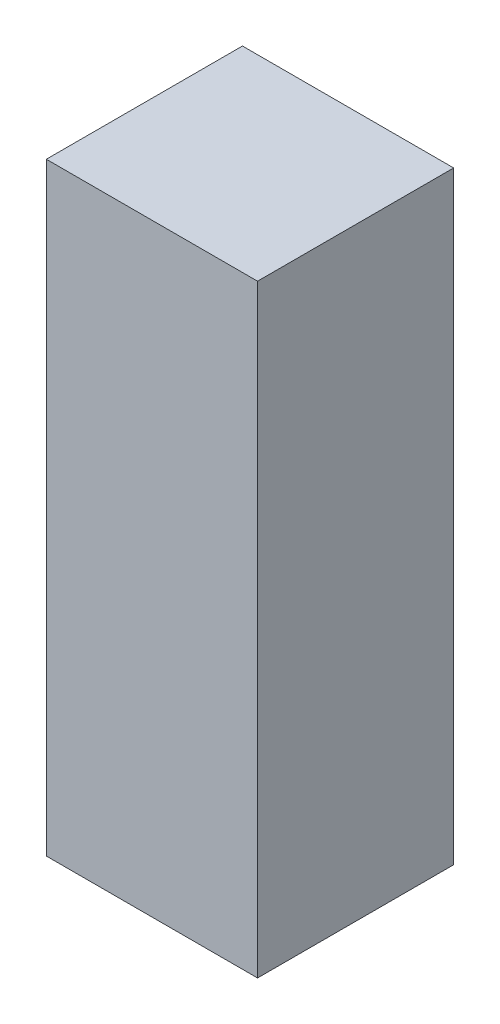
ISO-10303-21;
HEADER;
FILE_DESCRIPTION(('STEP AP214'),'2;1');
FILE_NAME('part.step','',(''),(''),'','','');
FILE_SCHEMA(('AUTOMOTIVE_DESIGN { 1 0 10303 214 1 1 1 1 }'));
ENDSEC;
DATA;
#1=APPLICATION_CONTEXT('core data for automotive mechanical design processes');
#2=APPLICATION_PROTOCOL_DEFINITION('international standard','automotive_design',2000,#1);
#3=PRODUCT_CONTEXT('',#1,'mechanical');
#4=PRODUCT('Part','Part','',(#3));
#5=PRODUCT_RELATED_PRODUCT_CATEGORY('part','',(#4));
#6=PRODUCT_DEFINITION_FORMATION('','',#4);
#7=PRODUCT_DEFINITION_CONTEXT('part definition',#1,'design');
#8=PRODUCT_DEFINITION('design','',#6,#7);
#9=PRODUCT_DEFINITION_SHAPE('','',#8);
#10=(LENGTH_UNIT() NAMED_UNIT(*) SI_UNIT(.MILLI.,.METRE.));
#11=(NAMED_UNIT(*) PLANE_ANGLE_UNIT() SI_UNIT($,.RADIAN.));
#12=(NAMED_UNIT(*) SI_UNIT($,.STERADIAN.) SOLID_ANGLE_UNIT());
#13=UNCERTAINTY_MEASURE_WITH_UNIT(LENGTH_MEASURE(1.E-05),#10,'distance_accuracy_value','');
#14=(GEOMETRIC_REPRESENTATION_CONTEXT(3) GLOBAL_UNCERTAINTY_ASSIGNED_CONTEXT((#13)) GLOBAL_UNIT_ASSIGNED_CONTEXT((#10,
#11,#12)) REPRESENTATION_CONTEXT('',''));
#15=CARTESIAN_POINT('',(0.,0.,0.));
#16=DIRECTION('',(0.,0.,1.));
#17=DIRECTION('',(1.,0.,0.));
#18=AXIS2_PLACEMENT_3D('',#15,#16,#17);
#19=CARTESIAN_POINT('',(24.,1870.,33.));
#20=DIRECTION('',(1.,0.,0.));
#21=DIRECTION('',(0.,0.,-1.));
#22=AXIS2_PLACEMENT_3D('',#19,#20,#21);
#23=PLANE('',#22);
#24=DIRECTION('',(0.,-1.,0.));
#25=VECTOR('',#24,1.);
#26=CARTESIAN_POINT('',(24.,1870.,20.));
#27=LINE('',#26,#25);
#28=CARTESIAN_POINT('',(24.,1910.,20.));
#29=VERTEX_POINT('',#28);
#30=CARTESIAN_POINT('',(24.,1870.,20.));
#31=VERTEX_POINT('',#30);
#32=EDGE_CURVE('E102',#29,#31,#27,.T.);
#33=ORIENTED_EDGE('',*,*,#32,.T.);
#34=DIRECTION('',(0.,0.,-1.));
#35=VECTOR('',#34,1.);
#36=CARTESIAN_POINT('',(24.,1870.,33.));
#37=LINE('',#36,#35);
#38=CARTESIAN_POINT('',(24.,1870.,33.));
#39=VERTEX_POINT('',#38);
#40=EDGE_CURVE('E11',#39,#31,#37,.T.);
#41=ORIENTED_EDGE('',*,*,#40,.F.);
#42=DIRECTION('',(0.,-1.,0.));
#43=VECTOR('',#42,1.);
#44=CARTESIAN_POINT('',(24.,1870.,33.));
#45=LINE('',#44,#43);
#46=CARTESIAN_POINT('',(24.,1910.,33.));
#47=VERTEX_POINT('',#46);
#48=EDGE_CURVE('E90',#47,#39,#45,.T.);
#49=ORIENTED_EDGE('',*,*,#48,.F.);
#50=DIRECTION('',(0.,0.,-1.));
#51=VECTOR('',#50,1.);
#52=CARTESIAN_POINT('',(24.,1910.,33.));
#53=LINE('',#52,#51);
#54=EDGE_CURVE('E98',#47,#29,#53,.T.);
#55=ORIENTED_EDGE('',*,*,#54,.T.);
#56=EDGE_LOOP('',(#33,#41,#49,#55));
#57=FACE_BOUND('',#56,.T.);
#58=ADVANCED_FACE('F39',(#57),#23,.F.);
#59=CARTESIAN_POINT('',(24.,1870.,33.));
#60=DIRECTION('',(0.,1.,0.));
#61=DIRECTION('',(0.,0.,1.));
#62=AXIS2_PLACEMENT_3D('',#59,#60,#61);
#63=PLANE('',#62);
#64=DIRECTION('',(1.,0.,0.));
#65=VECTOR('',#64,1.);
#66=CARTESIAN_POINT('',(24.,1870.,20.));
#67=LINE('',#66,#65);
#68=CARTESIAN_POINT('',(38.,1870.,20.));
#69=VERTEX_POINT('',#68);
#70=EDGE_CURVE('E94',#31,#69,#67,.T.);
#71=ORIENTED_EDGE('',*,*,#70,.T.);
#72=DIRECTION('',(0.,0.,-1.));
#73=VECTOR('',#72,1.);
#74=CARTESIAN_POINT('',(38.,1870.,33.));
#75=LINE('',#74,#73);
#76=CARTESIAN_POINT('',(38.,1870.,33.));
#77=VERTEX_POINT('',#76);
#78=EDGE_CURVE('E47',#77,#69,#75,.T.);
#79=ORIENTED_EDGE('',*,*,#78,.F.);
#80=DIRECTION('',(1.,0.,0.));
#81=VECTOR('',#80,1.);
#82=CARTESIAN_POINT('',(24.,1870.,33.));
#83=LINE('',#82,#81);
#84=EDGE_CURVE('E85',#39,#77,#83,.T.);
#85=ORIENTED_EDGE('',*,*,#84,.F.);
#86=ORIENTED_EDGE('',*,*,#40,.T.);
#87=EDGE_LOOP('',(#71,#79,#85,#86));
#88=FACE_BOUND('',#87,.T.);
#89=ADVANCED_FACE('F93',(#88),#63,.F.);
#90=CARTESIAN_POINT('',(38.,1870.,33.));
#91=DIRECTION('',(-1.,0.,0.));
#92=DIRECTION('',(0.,0.,1.));
#93=AXIS2_PLACEMENT_3D('',#90,#91,#92);
#94=PLANE('',#93);
#95=DIRECTION('',(0.,1.,0.));
#96=VECTOR('',#95,1.);
#97=CARTESIAN_POINT('',(38.,1870.,20.));
#98=LINE('',#97,#96);
#99=CARTESIAN_POINT('',(38.,1910.,20.));
#100=VERTEX_POINT('',#99);
#101=EDGE_CURVE('E72',#69,#100,#98,.T.);
#102=ORIENTED_EDGE('',*,*,#101,.T.);
#103=DIRECTION('',(0.,0.,-1.));
#104=VECTOR('',#103,1.);
#105=CARTESIAN_POINT('',(38.,1910.,33.));
#106=LINE('',#105,#104);
#107=CARTESIAN_POINT('',(38.,1910.,33.));
#108=VERTEX_POINT('',#107);
#109=EDGE_CURVE('E95',#108,#100,#106,.T.);
#110=ORIENTED_EDGE('',*,*,#109,.F.);
#111=DIRECTION('',(0.,1.,0.));
#112=VECTOR('',#111,1.);
#113=CARTESIAN_POINT('',(38.,1870.,33.));
#114=LINE('',#113,#112);
#115=EDGE_CURVE('E88',#77,#108,#114,.T.);
#116=ORIENTED_EDGE('',*,*,#115,.F.);
#117=ORIENTED_EDGE('',*,*,#78,.T.);
#118=EDGE_LOOP('',(#102,#110,#116,#117));
#119=FACE_BOUND('',#118,.T.);
#120=ADVANCED_FACE('F96',(#119),#94,.F.);
#121=CARTESIAN_POINT('',(24.,1910.,33.));
#122=DIRECTION('',(0.,-1.,0.));
#123=DIRECTION('',(0.,0.,-1.));
#124=AXIS2_PLACEMENT_3D('',#121,#122,#123);
#125=PLANE('',#124);
#126=DIRECTION('',(-1.,0.,0.));
#127=VECTOR('',#126,1.);
#128=CARTESIAN_POINT('',(24.,1910.,20.));
#129=LINE('',#128,#127);
#130=EDGE_CURVE('E78',#100,#29,#129,.T.);
#131=ORIENTED_EDGE('',*,*,#130,.T.);
#132=ORIENTED_EDGE('',*,*,#54,.F.);
#133=DIRECTION('',(-1.,0.,0.));
#134=VECTOR('',#133,1.);
#135=CARTESIAN_POINT('',(24.,1910.,33.));
#136=LINE('',#135,#134);
#137=EDGE_CURVE('E55',#108,#47,#136,.T.);
#138=ORIENTED_EDGE('',*,*,#137,.F.);
#139=ORIENTED_EDGE('',*,*,#109,.T.);
#140=EDGE_LOOP('',(#131,#132,#138,#139));
#141=FACE_BOUND('',#140,.T.);
#142=ADVANCED_FACE('F109',(#141),#125,.F.);
#143=CARTESIAN_POINT('',(0.,0.,33.));
#144=DIRECTION('',(0.,0.,-1.));
#145=DIRECTION('',(-1.,0.,0.));
#146=AXIS2_PLACEMENT_3D('',#143,#144,#145);
#147=PLANE('',#146);
#148=ORIENTED_EDGE('',*,*,#48,.T.);
#149=ORIENTED_EDGE('',*,*,#84,.T.);
#150=ORIENTED_EDGE('',*,*,#115,.T.);
#151=ORIENTED_EDGE('',*,*,#137,.T.);
#152=EDGE_LOOP('',(#148,#149,#150,#151));
#153=FACE_BOUND('',#152,.T.);
#154=ADVANCED_FACE('F86',(#153),#147,.F.);
#155=CARTESIAN_POINT('',(0.,0.,20.));
#156=DIRECTION('',(0.,0.,-1.));
#157=DIRECTION('',(-1.,0.,0.));
#158=AXIS2_PLACEMENT_3D('',#155,#156,#157);
#159=PLANE('',#158);
#160=ORIENTED_EDGE('',*,*,#32,.F.);
#161=ORIENTED_EDGE('',*,*,#130,.F.);
#162=ORIENTED_EDGE('',*,*,#101,.F.);
#163=ORIENTED_EDGE('',*,*,#70,.F.);
#164=EDGE_LOOP('',(#160,#161,#162,#163));
#165=FACE_BOUND('',#164,.T.);
#166=ADVANCED_FACE('F112',(#165),#159,.T.);
#167=CLOSED_SHELL('',(#58,#89,#120,#142,#154,#166));
#168=MANIFOLD_SOLID_BREP('B2',#167);
#169=ADVANCED_BREP_SHAPE_REPRESENTATION('',(#18,#168),#14);
#170=SHAPE_DEFINITION_REPRESENTATION(#9,#169);
ENDSEC;
END-ISO-10303-21;
